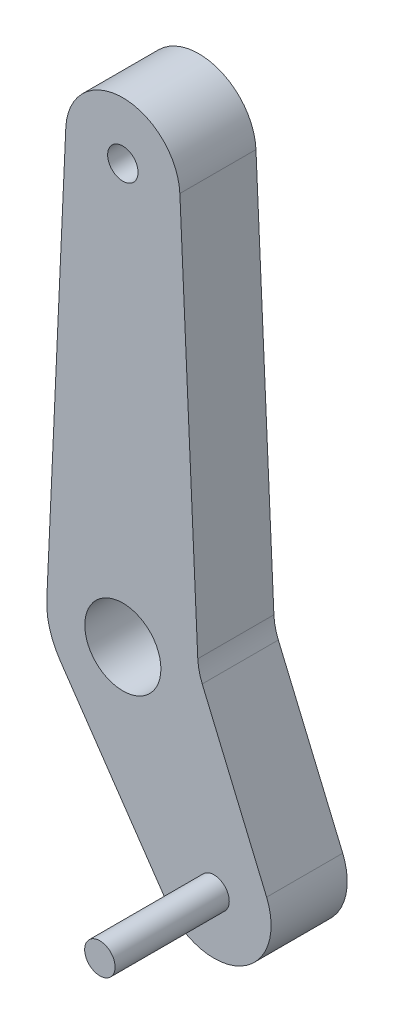
ISO-10303-21;
HEADER;
FILE_DESCRIPTION(('STEP AP214'),'2;1');
FILE_NAME('part.step','',(''),(''),'','','');
FILE_SCHEMA(('AUTOMOTIVE_DESIGN { 1 0 10303 214 1 1 1 1 }'));
ENDSEC;
DATA;
#1=APPLICATION_CONTEXT('core data for automotive mechanical design processes');
#2=APPLICATION_PROTOCOL_DEFINITION('international standard','automotive_design',2000,#1);
#3=PRODUCT_CONTEXT('',#1,'mechanical');
#4=PRODUCT('Part','Part','',(#3));
#5=PRODUCT_RELATED_PRODUCT_CATEGORY('part','',(#4));
#6=PRODUCT_DEFINITION_FORMATION('','',#4);
#7=PRODUCT_DEFINITION_CONTEXT('part definition',#1,'design');
#8=PRODUCT_DEFINITION('design','',#6,#7);
#9=PRODUCT_DEFINITION_SHAPE('','',#8);
#10=(LENGTH_UNIT() NAMED_UNIT(*) SI_UNIT(.MILLI.,.METRE.));
#11=(NAMED_UNIT(*) PLANE_ANGLE_UNIT() SI_UNIT($,.RADIAN.));
#12=(NAMED_UNIT(*) SI_UNIT($,.STERADIAN.) SOLID_ANGLE_UNIT());
#13=UNCERTAINTY_MEASURE_WITH_UNIT(LENGTH_MEASURE(1.E-05),#10,'distance_accuracy_value','');
#14=(GEOMETRIC_REPRESENTATION_CONTEXT(3) GLOBAL_UNCERTAINTY_ASSIGNED_CONTEXT((#13)) GLOBAL_UNIT_ASSIGNED_CONTEXT((#10,
#11,#12)) REPRESENTATION_CONTEXT('',''));
#15=CARTESIAN_POINT('',(0.,0.,0.));
#16=DIRECTION('',(0.,0.,1.));
#17=DIRECTION('',(1.,0.,0.));
#18=AXIS2_PLACEMENT_3D('',#15,#16,#17);
#19=CARTESIAN_POINT('',(34.6790709606594,7.84900709805678,20.));
#20=DIRECTION('',(0.,0.,1.));
#21=DIRECTION('',(1.,0.,0.));
#22=AXIS2_PLACEMENT_3D('',#19,#20,#21);
#23=PLANE('',#22);
#24=CARTESIAN_POINT('',(23.9652344492211,-43.8824285767534,20.));
#25=DIRECTION('',(0.,0.,1.));
#26=DIRECTION('',(1.,0.,0.));
#27=AXIS2_PLACEMENT_3D('',#24,#25,#26);
#28=CIRCLE('',#27,4.);
#29=CARTESIAN_POINT('',(27.9652344492211,-43.8824285767534,20.));
#30=VERTEX_POINT('',#29);
#31=EDGE_CURVE('E231',#30,#30,#28,.T.);
#32=ORIENTED_EDGE('',*,*,#31,.F.);
#33=EDGE_LOOP('',(#32));
#34=FACE_BOUND('',#33,.T.);
#35=CARTESIAN_POINT('',(0.,110.,20.));
#36=DIRECTION('',(0.,0.,1.));
#37=DIRECTION('',(1.,0.,0.));
#38=AXIS2_PLACEMENT_3D('',#35,#36,#37);
#39=CIRCLE('',#38,4.);
#40=CARTESIAN_POINT('',(4.,110.,20.));
#41=VERTEX_POINT('',#40);
#42=EDGE_CURVE('E152',#41,#41,#39,.T.);
#43=ORIENTED_EDGE('',*,*,#42,.F.);
#44=EDGE_LOOP('',(#43));
#45=FACE_BOUND('',#44,.T.);
#46=CARTESIAN_POINT('',(34.6790709606594,7.84900709805678,20.));
#47=DIRECTION('',(0.,0.,-1.));
#48=DIRECTION('',(1.,0.,0.));
#49=AXIS2_PLACEMENT_3D('',#46,#47,#48);
#50=CIRCLE('',#49,15.);
#51=CARTESIAN_POINT('',(20.8613743841033,2.01194779407239,20.));
#52=VERTEX_POINT('',#51);
#53=CARTESIAN_POINT('',(19.6945748407712,7.16718891623865,20.));
#54=VERTEX_POINT('',#53);
#55=EDGE_CURVE('E170',#52,#54,#50,.T.);
#56=ORIENTED_EDGE('',*,*,#55,.T.);
#57=DIRECTION('',(-0.0454545454545455,0.998966407992541,0.));
#58=VECTOR('',#57,1.);
#59=CARTESIAN_POINT('',(14.9844961198881,110.681818181818,20.));
#60=LINE('',#59,#58);
#61=CARTESIAN_POINT('',(14.9844961198881,110.681818181818,20.));
#62=VERTEX_POINT('',#61);
#63=EDGE_CURVE('E106',#54,#62,#60,.T.);
#64=ORIENTED_EDGE('',*,*,#63,.T.);
#65=CARTESIAN_POINT('',(0.,110.,20.));
#66=DIRECTION('',(0.,0.,1.));
#67=DIRECTION('',(1.,0.,0.));
#68=AXIS2_PLACEMENT_3D('',#65,#66,#67);
#69=CIRCLE('',#68,15.);
#70=CARTESIAN_POINT('',(-14.9844961198881,110.681818181818,20.));
#71=VERTEX_POINT('',#70);
#72=EDGE_CURVE('E191',#62,#71,#69,.T.);
#73=ORIENTED_EDGE('',*,*,#72,.T.);
#74=DIRECTION('',(-0.0454545454545455,-0.998966407992541,0.));
#75=VECTOR('',#74,1.);
#76=CARTESIAN_POINT('',(-14.9844961198881,110.681818181818,20.));
#77=LINE('',#76,#75);
#78=CARTESIAN_POINT('',(-19.9793281598508,0.90909090909091,20.));
#79=VERTEX_POINT('',#78);
#80=EDGE_CURVE('E205',#71,#79,#77,.T.);
#81=ORIENTED_EDGE('',*,*,#80,.T.);
#82=CARTESIAN_POINT('',(0.,0.,20.));
#83=DIRECTION('',(0.,0.,1.));
#84=DIRECTION('',(1.,0.,0.));
#85=AXIS2_PLACEMENT_3D('',#82,#83,#84);
#86=CIRCLE('',#85,20.);
#87=CARTESIAN_POINT('',(-16.5063766794704,-11.2933400247861,20.));
#88=VERTEX_POINT('',#87);
#89=EDGE_CURVE('E125',#79,#88,#86,.T.);
#90=ORIENTED_EDGE('',*,*,#89,.T.);
#91=DIRECTION('',(0.564667001239303,-0.825318833973521,0.));
#92=VECTOR('',#91,1.);
#93=CARTESIAN_POINT('',(-16.5063766794704,-11.2933400247861,20.));
#94=LINE('',#93,#92);
#95=CARTESIAN_POINT('',(11.5854519396183,-52.352433595343,20.));
#96=VERTEX_POINT('',#95);
#97=EDGE_CURVE('E119',#88,#96,#94,.T.);
#98=ORIENTED_EDGE('',*,*,#97,.T.);
#99=CARTESIAN_POINT('',(23.9652344492211,-43.8824285767534,20.));
#100=DIRECTION('',(0.,0.,1.));
#101=DIRECTION('',(1.,0.,0.));
#102=AXIS2_PLACEMENT_3D('',#99,#100,#101);
#103=CIRCLE('',#102,15.);
#104=CARTESIAN_POINT('',(37.7829310257772,-38.0453692727691,20.));
#105=VERTEX_POINT('',#104);
#106=EDGE_CURVE('E123',#96,#105,#103,.T.);
#107=ORIENTED_EDGE('',*,*,#106,.T.);
#108=DIRECTION('',(-0.389137286932289,0.921179771770406,0.));
#109=VECTOR('',#108,1.);
#110=CARTESIAN_POINT('',(37.7829310257772,-38.0453692727691,20.));
#111=LINE('',#110,#109);
#112=EDGE_CURVE('E63',#105,#52,#111,.T.);
#113=ORIENTED_EDGE('',*,*,#112,.T.);
#114=EDGE_LOOP('',(#56,#64,#73,#81,#90,#98,#107,#113));
#115=FACE_BOUND('',#114,.T.);
#116=CARTESIAN_POINT('',(0.,0.,20.));
#117=DIRECTION('',(0.,0.,1.));
#118=DIRECTION('',(1.,0.,0.));
#119=AXIS2_PLACEMENT_3D('',#116,#117,#118);
#120=CIRCLE('',#119,10.);
#121=CARTESIAN_POINT('',(10.,0.,20.));
#122=VERTEX_POINT('',#121);
#123=EDGE_CURVE('E219',#122,#122,#120,.T.);
#124=ORIENTED_EDGE('',*,*,#123,.F.);
#125=EDGE_LOOP('',(#124));
#126=FACE_BOUND('',#125,.T.);
#127=ADVANCED_FACE('F45',(#34,#45,#115,#126),#23,.T.);
#128=CARTESIAN_POINT('',(34.6790709606594,7.84900709805678,0.));
#129=DIRECTION('',(0.,0.,1.));
#130=DIRECTION('',(1.,0.,0.));
#131=AXIS2_PLACEMENT_3D('',#128,#129,#130);
#132=PLANE('',#131);
#133=CARTESIAN_POINT('',(34.6790709606594,7.84900709805678,0.));
#134=DIRECTION('',(0.,0.,-1.));
#135=DIRECTION('',(1.,0.,0.));
#136=AXIS2_PLACEMENT_3D('',#133,#134,#135);
#137=CIRCLE('',#136,15.);
#138=CARTESIAN_POINT('',(20.8613743841033,2.01194779407239,0.));
#139=VERTEX_POINT('',#138);
#140=CARTESIAN_POINT('',(19.6945748407712,7.16718891623865,0.));
#141=VERTEX_POINT('',#140);
#142=EDGE_CURVE('E147',#139,#141,#137,.T.);
#143=ORIENTED_EDGE('',*,*,#142,.F.);
#144=DIRECTION('',(-0.389137286932289,0.921179771770406,0.));
#145=VECTOR('',#144,1.);
#146=CARTESIAN_POINT('',(37.7829310257772,-38.0453692727691,0.));
#147=LINE('',#146,#145);
#148=CARTESIAN_POINT('',(37.7829310257772,-38.0453692727691,0.));
#149=VERTEX_POINT('',#148);
#150=EDGE_CURVE('E98',#149,#139,#147,.T.);
#151=ORIENTED_EDGE('',*,*,#150,.F.);
#152=CARTESIAN_POINT('',(23.9652344492211,-43.8824285767534,0.));
#153=DIRECTION('',(0.,0.,1.));
#154=DIRECTION('',(1.,0.,0.));
#155=AXIS2_PLACEMENT_3D('',#152,#153,#154);
#156=CIRCLE('',#155,15.);
#157=CARTESIAN_POINT('',(11.5854519396183,-52.352433595343,0.));
#158=VERTEX_POINT('',#157);
#159=EDGE_CURVE('E92',#158,#149,#156,.T.);
#160=ORIENTED_EDGE('',*,*,#159,.F.);
#161=DIRECTION('',(0.564667001239303,-0.825318833973521,0.));
#162=VECTOR('',#161,1.);
#163=CARTESIAN_POINT('',(-16.5063766794704,-11.2933400247861,0.));
#164=LINE('',#163,#162);
#165=CARTESIAN_POINT('',(-16.5063766794704,-11.2933400247861,0.));
#166=VERTEX_POINT('',#165);
#167=EDGE_CURVE('E134',#166,#158,#164,.T.);
#168=ORIENTED_EDGE('',*,*,#167,.F.);
#169=CARTESIAN_POINT('',(0.,0.,0.));
#170=DIRECTION('',(0.,0.,1.));
#171=DIRECTION('',(1.,0.,0.));
#172=AXIS2_PLACEMENT_3D('',#169,#170,#171);
#173=CIRCLE('',#172,20.);
#174=CARTESIAN_POINT('',(-19.9793281598508,0.90909090909091,0.));
#175=VERTEX_POINT('',#174);
#176=EDGE_CURVE('E161',#175,#166,#173,.T.);
#177=ORIENTED_EDGE('',*,*,#176,.F.);
#178=DIRECTION('',(-0.0454545454545455,-0.998966407992541,0.));
#179=VECTOR('',#178,1.);
#180=CARTESIAN_POINT('',(-14.9844961198881,110.681818181818,0.));
#181=LINE('',#180,#179);
#182=CARTESIAN_POINT('',(-14.9844961198881,110.681818181818,0.));
#183=VERTEX_POINT('',#182);
#184=EDGE_CURVE('E158',#183,#175,#181,.T.);
#185=ORIENTED_EDGE('',*,*,#184,.F.);
#186=CARTESIAN_POINT('',(0.,110.,0.));
#187=DIRECTION('',(0.,0.,1.));
#188=DIRECTION('',(1.,0.,0.));
#189=AXIS2_PLACEMENT_3D('',#186,#187,#188);
#190=CIRCLE('',#189,15.);
#191=CARTESIAN_POINT('',(14.9844961198881,110.681818181818,0.));
#192=VERTEX_POINT('',#191);
#193=EDGE_CURVE('E155',#192,#183,#190,.T.);
#194=ORIENTED_EDGE('',*,*,#193,.F.);
#195=DIRECTION('',(-0.0454545454545455,0.998966407992541,0.));
#196=VECTOR('',#195,1.);
#197=CARTESIAN_POINT('',(14.9844961198881,110.681818181818,0.));
#198=LINE('',#197,#196);
#199=EDGE_CURVE('E151',#141,#192,#198,.T.);
#200=ORIENTED_EDGE('',*,*,#199,.F.);
#201=EDGE_LOOP('',(#143,#151,#160,#168,#177,#185,#194,#200));
#202=FACE_BOUND('',#201,.T.);
#203=CARTESIAN_POINT('',(0.,110.,0.));
#204=DIRECTION('',(0.,0.,1.));
#205=DIRECTION('',(1.,0.,0.));
#206=AXIS2_PLACEMENT_3D('',#203,#204,#205);
#207=CIRCLE('',#206,4.);
#208=CARTESIAN_POINT('',(4.,110.,0.));
#209=VERTEX_POINT('',#208);
#210=EDGE_CURVE('E215',#209,#209,#207,.T.);
#211=ORIENTED_EDGE('',*,*,#210,.T.);
#212=EDGE_LOOP('',(#211));
#213=FACE_BOUND('',#212,.T.);
#214=CARTESIAN_POINT('',(0.,0.,0.));
#215=DIRECTION('',(0.,0.,1.));
#216=DIRECTION('',(1.,0.,0.));
#217=AXIS2_PLACEMENT_3D('',#214,#215,#216);
#218=CIRCLE('',#217,10.);
#219=CARTESIAN_POINT('',(10.,0.,0.));
#220=VERTEX_POINT('',#219);
#221=EDGE_CURVE('E223',#220,#220,#218,.T.);
#222=ORIENTED_EDGE('',*,*,#221,.T.);
#223=EDGE_LOOP('',(#222));
#224=FACE_BOUND('',#223,.T.);
#225=ADVANCED_FACE('F195',(#202,#213,#224),#132,.F.);
#226=CARTESIAN_POINT('',(34.6790709606594,7.84900709805678,20.));
#227=DIRECTION('',(0.,0.,-1.));
#228=DIRECTION('',(-1.,0.,0.));
#229=AXIS2_PLACEMENT_3D('',#226,#227,#228);
#230=CYLINDRICAL_SURFACE('',#229,15.);
#231=ORIENTED_EDGE('',*,*,#142,.T.);
#232=DIRECTION('',(0.,0.,-1.));
#233=VECTOR('',#232,1.);
#234=CARTESIAN_POINT('',(19.6945748407712,7.16718891623865,20.));
#235=LINE('',#234,#233);
#236=EDGE_CURVE('E11',#54,#141,#235,.T.);
#237=ORIENTED_EDGE('',*,*,#236,.F.);
#238=ORIENTED_EDGE('',*,*,#55,.F.);
#239=DIRECTION('',(0.,0.,-1.));
#240=VECTOR('',#239,1.);
#241=CARTESIAN_POINT('',(20.8613743841033,2.01194779407239,20.));
#242=LINE('',#241,#240);
#243=EDGE_CURVE('E143',#52,#139,#242,.T.);
#244=ORIENTED_EDGE('',*,*,#243,.T.);
#245=EDGE_LOOP('',(#231,#237,#238,#244));
#246=FACE_BOUND('',#245,.T.);
#247=ADVANCED_FACE('F47',(#246),#230,.F.);
#248=CARTESIAN_POINT('',(14.9844961198881,110.681818181818,20.));
#249=DIRECTION('',(-0.998966407992541,-0.0454545454545455,0.));
#250=DIRECTION('',(0.0454545454545455,-0.998966407992541,0.));
#251=AXIS2_PLACEMENT_3D('',#248,#249,#250);
#252=PLANE('',#251);
#253=ORIENTED_EDGE('',*,*,#199,.T.);
#254=DIRECTION('',(0.,0.,-1.));
#255=VECTOR('',#254,1.);
#256=CARTESIAN_POINT('',(14.9844961198881,110.681818181818,20.));
#257=LINE('',#256,#255);
#258=EDGE_CURVE('E55',#62,#192,#257,.T.);
#259=ORIENTED_EDGE('',*,*,#258,.F.);
#260=ORIENTED_EDGE('',*,*,#63,.F.);
#261=ORIENTED_EDGE('',*,*,#236,.T.);
#262=EDGE_LOOP('',(#253,#259,#260,#261));
#263=FACE_BOUND('',#262,.T.);
#264=ADVANCED_FACE('F282',(#263),#252,.F.);
#265=CARTESIAN_POINT('',(0.,110.,20.));
#266=DIRECTION('',(0.,0.,-1.));
#267=DIRECTION('',(-1.,0.,0.));
#268=AXIS2_PLACEMENT_3D('',#265,#266,#267);
#269=CYLINDRICAL_SURFACE('',#268,15.);
#270=ORIENTED_EDGE('',*,*,#193,.T.);
#271=DIRECTION('',(0.,0.,-1.));
#272=VECTOR('',#271,1.);
#273=CARTESIAN_POINT('',(-14.9844961198881,110.681818181818,20.));
#274=LINE('',#273,#272);
#275=EDGE_CURVE('E181',#71,#183,#274,.T.);
#276=ORIENTED_EDGE('',*,*,#275,.F.);
#277=ORIENTED_EDGE('',*,*,#72,.F.);
#278=ORIENTED_EDGE('',*,*,#258,.T.);
#279=EDGE_LOOP('',(#270,#276,#277,#278));
#280=FACE_BOUND('',#279,.T.);
#281=ADVANCED_FACE('F189',(#280),#269,.T.);
#282=CARTESIAN_POINT('',(-14.9844961198881,110.681818181818,20.));
#283=DIRECTION('',(0.998966407992541,-0.0454545454545455,0.));
#284=DIRECTION('',(0.0454545454545455,0.998966407992541,0.));
#285=AXIS2_PLACEMENT_3D('',#282,#283,#284);
#286=PLANE('',#285);
#287=ORIENTED_EDGE('',*,*,#184,.T.);
#288=DIRECTION('',(0.,0.,-1.));
#289=VECTOR('',#288,1.);
#290=CARTESIAN_POINT('',(-19.9793281598508,0.90909090909091,20.));
#291=LINE('',#290,#289);
#292=EDGE_CURVE('E177',#79,#175,#291,.T.);
#293=ORIENTED_EDGE('',*,*,#292,.F.);
#294=ORIENTED_EDGE('',*,*,#80,.F.);
#295=ORIENTED_EDGE('',*,*,#275,.T.);
#296=EDGE_LOOP('',(#287,#293,#294,#295));
#297=FACE_BOUND('',#296,.T.);
#298=ADVANCED_FACE('F200',(#297),#286,.F.);
#299=CARTESIAN_POINT('',(0.,0.,20.));
#300=DIRECTION('',(0.,0.,-1.));
#301=DIRECTION('',(-1.,0.,0.));
#302=AXIS2_PLACEMENT_3D('',#299,#300,#301);
#303=CYLINDRICAL_SURFACE('',#302,20.);
#304=ORIENTED_EDGE('',*,*,#176,.T.);
#305=DIRECTION('',(0.,0.,-1.));
#306=VECTOR('',#305,1.);
#307=CARTESIAN_POINT('',(-16.5063766794704,-11.2933400247861,20.));
#308=LINE('',#307,#306);
#309=EDGE_CURVE('E136',#88,#166,#308,.T.);
#310=ORIENTED_EDGE('',*,*,#309,.F.);
#311=ORIENTED_EDGE('',*,*,#89,.F.);
#312=ORIENTED_EDGE('',*,*,#292,.T.);
#313=EDGE_LOOP('',(#304,#310,#311,#312));
#314=FACE_BOUND('',#313,.T.);
#315=ADVANCED_FACE('F203',(#314),#303,.T.);
#316=CARTESIAN_POINT('',(-16.5063766794704,-11.2933400247861,20.));
#317=DIRECTION('',(0.825318833973521,0.564667001239303,0.));
#318=DIRECTION('',(-0.564667001239303,0.825318833973521,0.));
#319=AXIS2_PLACEMENT_3D('',#316,#317,#318);
#320=PLANE('',#319);
#321=ORIENTED_EDGE('',*,*,#167,.T.);
#322=DIRECTION('',(0.,0.,-1.));
#323=VECTOR('',#322,1.);
#324=CARTESIAN_POINT('',(11.5854519396183,-52.352433595343,20.));
#325=LINE('',#324,#323);
#326=EDGE_CURVE('E131',#96,#158,#325,.T.);
#327=ORIENTED_EDGE('',*,*,#326,.F.);
#328=ORIENTED_EDGE('',*,*,#97,.F.);
#329=ORIENTED_EDGE('',*,*,#309,.T.);
#330=EDGE_LOOP('',(#321,#327,#328,#329));
#331=FACE_BOUND('',#330,.T.);
#332=ADVANCED_FACE('F132',(#331),#320,.F.);
#333=CARTESIAN_POINT('',(23.9652344492211,-43.8824285767534,20.));
#334=DIRECTION('',(0.,0.,-1.));
#335=DIRECTION('',(-1.,0.,0.));
#336=AXIS2_PLACEMENT_3D('',#333,#334,#335);
#337=CYLINDRICAL_SURFACE('',#336,15.);
#338=ORIENTED_EDGE('',*,*,#159,.T.);
#339=DIRECTION('',(0.,0.,-1.));
#340=VECTOR('',#339,1.);
#341=CARTESIAN_POINT('',(37.7829310257772,-38.0453692727691,20.));
#342=LINE('',#341,#340);
#343=EDGE_CURVE('E137',#105,#149,#342,.T.);
#344=ORIENTED_EDGE('',*,*,#343,.F.);
#345=ORIENTED_EDGE('',*,*,#106,.F.);
#346=ORIENTED_EDGE('',*,*,#326,.T.);
#347=EDGE_LOOP('',(#338,#344,#345,#346));
#348=FACE_BOUND('',#347,.T.);
#349=ADVANCED_FACE('F139',(#348),#337,.T.);
#350=CARTESIAN_POINT('',(37.7829310257772,-38.0453692727691,20.));
#351=DIRECTION('',(-0.921179771770406,-0.389137286932289,0.));
#352=DIRECTION('',(0.389137286932289,-0.921179771770406,0.));
#353=AXIS2_PLACEMENT_3D('',#350,#351,#352);
#354=PLANE('',#353);
#355=ORIENTED_EDGE('',*,*,#150,.T.);
#356=ORIENTED_EDGE('',*,*,#243,.F.);
#357=ORIENTED_EDGE('',*,*,#112,.F.);
#358=ORIENTED_EDGE('',*,*,#343,.T.);
#359=EDGE_LOOP('',(#355,#356,#357,#358));
#360=FACE_BOUND('',#359,.T.);
#361=ADVANCED_FACE('F256',(#360),#354,.F.);
#362=CARTESIAN_POINT('',(0.,110.,20.));
#363=DIRECTION('',(0.,0.,-1.));
#364=DIRECTION('',(-1.,0.,0.));
#365=AXIS2_PLACEMENT_3D('',#362,#363,#364);
#366=CYLINDRICAL_SURFACE('',#365,4.);
#367=ORIENTED_EDGE('',*,*,#42,.T.);
#368=EDGE_LOOP('',(#367));
#369=FACE_BOUND('',#368,.T.);
#370=ORIENTED_EDGE('',*,*,#210,.F.);
#371=EDGE_LOOP('',(#370));
#372=FACE_BOUND('',#371,.T.);
#373=ADVANCED_FACE('F253',(#369,#372),#366,.F.);
#374=CARTESIAN_POINT('',(0.,0.,20.));
#375=DIRECTION('',(0.,0.,-1.));
#376=DIRECTION('',(-1.,0.,0.));
#377=AXIS2_PLACEMENT_3D('',#374,#375,#376);
#378=CYLINDRICAL_SURFACE('',#377,10.);
#379=ORIENTED_EDGE('',*,*,#123,.T.);
#380=EDGE_LOOP('',(#379));
#381=FACE_BOUND('',#380,.T.);
#382=ORIENTED_EDGE('',*,*,#221,.F.);
#383=EDGE_LOOP('',(#382));
#384=FACE_BOUND('',#383,.T.);
#385=ADVANCED_FACE('F244',(#381,#384),#378,.F.);
#386=CARTESIAN_POINT('',(23.9652344492211,-43.8824285767534,50.));
#387=DIRECTION('',(0.,0.,-1.));
#388=DIRECTION('',(-1.,0.,0.));
#389=AXIS2_PLACEMENT_3D('',#386,#387,#388);
#390=CYLINDRICAL_SURFACE('',#389,4.);
#391=CARTESIAN_POINT('',(23.9652344492211,-43.8824285767534,50.));
#392=DIRECTION('',(0.,0.,1.));
#393=DIRECTION('',(1.,0.,0.));
#394=AXIS2_PLACEMENT_3D('',#391,#392,#393);
#395=CIRCLE('',#394,4.);
#396=CARTESIAN_POINT('',(27.9652344492211,-43.8824285767534,50.));
#397=VERTEX_POINT('',#396);
#398=EDGE_CURVE('E227',#397,#397,#395,.T.);
#399=ORIENTED_EDGE('',*,*,#398,.F.);
#400=EDGE_LOOP('',(#399));
#401=FACE_BOUND('',#400,.T.);
#402=ORIENTED_EDGE('',*,*,#31,.T.);
#403=EDGE_LOOP('',(#402));
#404=FACE_BOUND('',#403,.T.);
#405=ADVANCED_FACE('F241',(#401,#404),#390,.T.);
#406=CARTESIAN_POINT('',(23.9652344492211,-43.8824285767534,50.));
#407=DIRECTION('',(0.,0.,1.));
#408=DIRECTION('',(1.,0.,0.));
#409=AXIS2_PLACEMENT_3D('',#406,#407,#408);
#410=PLANE('',#409);
#411=ORIENTED_EDGE('',*,*,#398,.T.);
#412=EDGE_LOOP('',(#411));
#413=FACE_BOUND('',#412,.T.);
#414=ADVANCED_FACE('F239',(#413),#410,.T.);
#415=CLOSED_SHELL('',(#127,#225,#247,#264,#281,#298,#315,#332,#349,#361,#373,#385,#405,#414));
#416=MANIFOLD_SOLID_BREP('B2',#415);
#417=ADVANCED_BREP_SHAPE_REPRESENTATION('',(#18,#416),#14);
#418=SHAPE_DEFINITION_REPRESENTATION(#9,#417);
ENDSEC;
END-ISO-10303-21;
